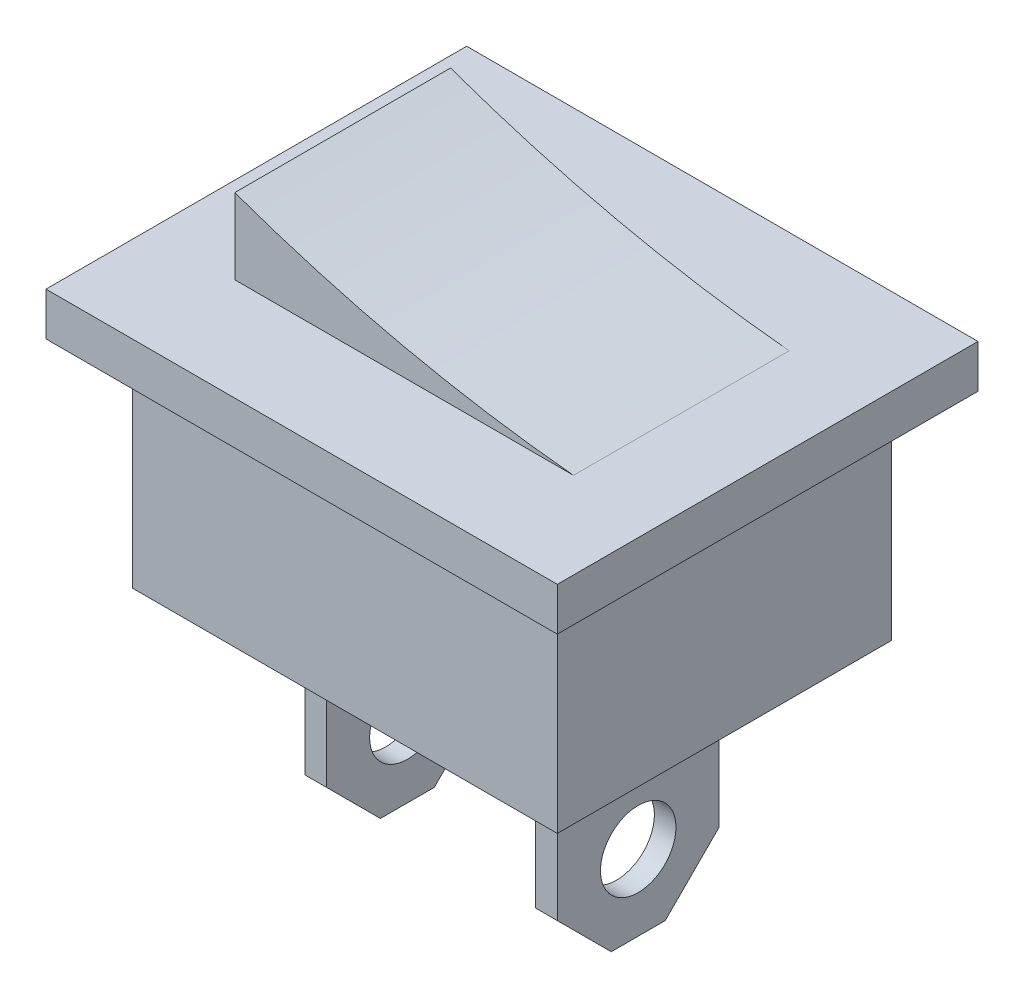
ISO-10303-21;
HEADER;
FILE_DESCRIPTION(('STEP AP214'),'2;1');
FILE_NAME('part.step','',(''),(''),'','','');
FILE_SCHEMA(('AUTOMOTIVE_DESIGN { 1 0 10303 214 1 1 1 1 }'));
ENDSEC;
DATA;
#1=APPLICATION_CONTEXT('core data for automotive mechanical design processes');
#2=APPLICATION_PROTOCOL_DEFINITION('international standard','automotive_design',2000,#1);
#3=PRODUCT_CONTEXT('',#1,'mechanical');
#4=PRODUCT('Part','Part','',(#3));
#5=PRODUCT_RELATED_PRODUCT_CATEGORY('part','',(#4));
#6=PRODUCT_DEFINITION_FORMATION('','',#4);
#7=PRODUCT_DEFINITION_CONTEXT('part definition',#1,'design');
#8=PRODUCT_DEFINITION('design','',#6,#7);
#9=PRODUCT_DEFINITION_SHAPE('','',#8);
#10=(LENGTH_UNIT() NAMED_UNIT(*) SI_UNIT(.MILLI.,.METRE.));
#11=(NAMED_UNIT(*) PLANE_ANGLE_UNIT() SI_UNIT($,.RADIAN.));
#12=(NAMED_UNIT(*) SI_UNIT($,.STERADIAN.) SOLID_ANGLE_UNIT());
#13=UNCERTAINTY_MEASURE_WITH_UNIT(LENGTH_MEASURE(1.E-05),#10,'distance_accuracy_value','');
#14=(GEOMETRIC_REPRESENTATION_CONTEXT(3) GLOBAL_UNCERTAINTY_ASSIGNED_CONTEXT((#13)) GLOBAL_UNIT_ASSIGNED_CONTEXT((#10,
#11,#12)) REPRESENTATION_CONTEXT('',''));
#15=CARTESIAN_POINT('',(0.,0.,0.));
#16=DIRECTION('',(0.,0.,1.));
#17=DIRECTION('',(1.,0.,0.));
#18=AXIS2_PLACEMENT_3D('',#15,#16,#17);
#19=CARTESIAN_POINT('',(2.,12.,-2.75));
#20=DIRECTION('',(0.,1.,0.));
#21=DIRECTION('',(0.,0.,1.));
#22=AXIS2_PLACEMENT_3D('',#19,#20,#21);
#23=PLANE('',#22);
#24=DIRECTION('',(1.,0.,0.));
#25=VECTOR('',#24,1.);
#26=CARTESIAN_POINT('',(2.,12.,-12.75));
#27=LINE('',#26,#25);
#28=CARTESIAN_POINT('',(2.,12.,-12.75));
#29=VERTEX_POINT('',#28);
#30=CARTESIAN_POINT('',(17.7,12.,-12.75));
#31=VERTEX_POINT('',#30);
#32=EDGE_CURVE('E95',#29,#31,#27,.T.);
#33=ORIENTED_EDGE('',*,*,#32,.T.);
#34=DIRECTION('',(0.,0.,-1.));
#35=VECTOR('',#34,1.);
#36=CARTESIAN_POINT('',(17.7,12.,-2.75));
#37=LINE('',#36,#35);
#38=CARTESIAN_POINT('',(17.7,12.,-2.75));
#39=VERTEX_POINT('',#38);
#40=EDGE_CURVE('E12',#39,#31,#37,.T.);
#41=ORIENTED_EDGE('',*,*,#40,.F.);
#42=DIRECTION('',(1.,0.,0.));
#43=VECTOR('',#42,1.);
#44=CARTESIAN_POINT('',(2.,12.,-2.75));
#45=LINE('',#44,#43);
#46=CARTESIAN_POINT('',(2.,12.,-2.75));
#47=VERTEX_POINT('',#46);
#48=EDGE_CURVE('E88',#47,#39,#45,.T.);
#49=ORIENTED_EDGE('',*,*,#48,.F.);
#50=DIRECTION('',(0.,0.,-1.));
#51=VECTOR('',#50,1.);
#52=CARTESIAN_POINT('',(2.,12.,-2.75));
#53=LINE('',#52,#51);
#54=EDGE_CURVE('E96',#47,#29,#53,.T.);
#55=ORIENTED_EDGE('',*,*,#54,.T.);
#56=EDGE_LOOP('',(#33,#41,#49,#55));
#57=FACE_BOUND('',#56,.T.);
#58=ADVANCED_FACE('F48',(#57),#23,.F.);
#59=CARTESIAN_POINT('',(23.8845782013658,76.705107931841,-2.75));
#60=DIRECTION('',(0.,0.,-1.));
#61=DIRECTION('',(-1.,0.,0.));
#62=AXIS2_PLACEMENT_3D('',#59,#60,#61);
#63=CYLINDRICAL_SURFACE('',#62,65.);
#64=CARTESIAN_POINT('',(23.8845782013658,76.705107931841,-12.75));
#65=DIRECTION('',(0.,0.,-1.));
#66=DIRECTION('',(1.,0.,0.));
#67=AXIS2_PLACEMENT_3D('',#64,#65,#66);
#68=CIRCLE('',#67,65.);
#69=CARTESIAN_POINT('',(2.,15.5,-12.75));
#70=VERTEX_POINT('',#69);
#71=EDGE_CURVE('E76',#31,#70,#68,.T.);
#72=ORIENTED_EDGE('',*,*,#71,.T.);
#73=DIRECTION('',(0.,0.,-1.));
#74=VECTOR('',#73,1.);
#75=CARTESIAN_POINT('',(2.,15.5,-2.75));
#76=LINE('',#75,#74);
#77=CARTESIAN_POINT('',(2.,15.5,-2.75));
#78=VERTEX_POINT('',#77);
#79=EDGE_CURVE('E56',#78,#70,#76,.T.);
#80=ORIENTED_EDGE('',*,*,#79,.F.);
#81=CARTESIAN_POINT('',(23.8845782013658,76.705107931841,-2.75));
#82=DIRECTION('',(0.,0.,-1.));
#83=DIRECTION('',(1.,0.,0.));
#84=AXIS2_PLACEMENT_3D('',#81,#82,#83);
#85=CIRCLE('',#84,65.);
#86=EDGE_CURVE('E84',#39,#78,#85,.T.);
#87=ORIENTED_EDGE('',*,*,#86,.F.);
#88=ORIENTED_EDGE('',*,*,#40,.T.);
#89=EDGE_LOOP('',(#72,#80,#87,#88));
#90=FACE_BOUND('',#89,.T.);
#91=ADVANCED_FACE('F85',(#90),#63,.F.);
#92=CARTESIAN_POINT('',(2.,12.,-2.75));
#93=DIRECTION('',(1.,0.,0.));
#94=DIRECTION('',(0.,0.,-1.));
#95=AXIS2_PLACEMENT_3D('',#92,#93,#94);
#96=PLANE('',#95);
#97=DIRECTION('',(0.,-1.,0.));
#98=VECTOR('',#97,1.);
#99=CARTESIAN_POINT('',(2.,12.,-12.75));
#100=LINE('',#99,#98);
#101=EDGE_CURVE('E81',#70,#29,#100,.T.);
#102=ORIENTED_EDGE('',*,*,#101,.T.);
#103=ORIENTED_EDGE('',*,*,#54,.F.);
#104=DIRECTION('',(0.,-1.,0.));
#105=VECTOR('',#104,1.);
#106=CARTESIAN_POINT('',(2.,12.,-2.75));
#107=LINE('',#106,#105);
#108=EDGE_CURVE('E64',#78,#47,#107,.T.);
#109=ORIENTED_EDGE('',*,*,#108,.F.);
#110=ORIENTED_EDGE('',*,*,#79,.T.);
#111=EDGE_LOOP('',(#102,#103,#109,#110));
#112=FACE_BOUND('',#111,.T.);
#113=ADVANCED_FACE('F103',(#112),#96,.F.);
#114=CARTESIAN_POINT('',(23.8845782013658,76.705107931841,-2.75));
#115=DIRECTION('',(0.,0.,1.));
#116=DIRECTION('',(1.,0.,0.));
#117=AXIS2_PLACEMENT_3D('',#114,#115,#116);
#118=PLANE('',#117);
#119=ORIENTED_EDGE('',*,*,#48,.T.);
#120=ORIENTED_EDGE('',*,*,#86,.T.);
#121=ORIENTED_EDGE('',*,*,#108,.T.);
#122=EDGE_LOOP('',(#119,#120,#121));
#123=FACE_BOUND('',#122,.T.);
#124=ADVANCED_FACE('F91',(#123),#118,.T.);
#125=CARTESIAN_POINT('',(23.8845782013658,76.705107931841,-12.75));
#126=DIRECTION('',(0.,0.,1.));
#127=DIRECTION('',(1.,0.,0.));
#128=AXIS2_PLACEMENT_3D('',#125,#126,#127);
#129=PLANE('',#128);
#130=ORIENTED_EDGE('',*,*,#32,.F.);
#131=ORIENTED_EDGE('',*,*,#101,.F.);
#132=ORIENTED_EDGE('',*,*,#71,.F.);
#133=EDGE_LOOP('',(#130,#131,#132));
#134=FACE_BOUND('',#133,.T.);
#135=ADVANCED_FACE('F104',(#134),#129,.F.);
#136=CLOSED_SHELL('',(#58,#91,#113,#124,#135));
#137=MANIFOLD_SOLID_BREP('B2',#136);
#138=CARTESIAN_POINT('',(0.,0.,0.));
#139=DIRECTION('',(0.,-1.,0.));
#140=DIRECTION('',(0.,0.,-1.));
#141=AXIS2_PLACEMENT_3D('',#138,#139,#140);
#142=PLANE('',#141);
#143=DIRECTION('',(0.,0.,1.));
#144=VECTOR('',#143,1.);
#145=CARTESIAN_POINT('',(0.,0.,0.));
#146=LINE('',#145,#144);
#147=CARTESIAN_POINT('',(0.,0.,-15.5));
#148=VERTEX_POINT('',#147);
#149=CARTESIAN_POINT('',(0.,0.,0.));
#150=VERTEX_POINT('',#149);
#151=EDGE_CURVE('E408',#148,#150,#146,.T.);
#152=ORIENTED_EDGE('',*,*,#151,.F.);
#153=DIRECTION('',(-1.,0.,0.));
#154=VECTOR('',#153,1.);
#155=CARTESIAN_POINT('',(0.,0.,-15.5));
#156=LINE('',#155,#154);
#157=CARTESIAN_POINT('',(19.7,0.,-15.5));
#158=VERTEX_POINT('',#157);
#159=EDGE_CURVE('E414',#158,#148,#156,.T.);
#160=ORIENTED_EDGE('',*,*,#159,.F.);
#161=DIRECTION('',(0.,0.,-1.));
#162=VECTOR('',#161,1.);
#163=CARTESIAN_POINT('',(19.7,0.,0.));
#164=LINE('',#163,#162);
#165=CARTESIAN_POINT('',(19.7,0.,0.));
#166=VERTEX_POINT('',#165);
#167=EDGE_CURVE('E433',#166,#158,#164,.T.);
#168=ORIENTED_EDGE('',*,*,#167,.F.);
#169=DIRECTION('',(1.,0.,0.));
#170=VECTOR('',#169,1.);
#171=CARTESIAN_POINT('',(0.,0.,0.));
#172=LINE('',#171,#170);
#173=EDGE_CURVE('E430',#150,#166,#172,.T.);
#174=ORIENTED_EDGE('',*,*,#173,.F.);
#175=EDGE_LOOP('',(#152,#160,#168,#174));
#176=FACE_BOUND('',#175,.T.);
#177=DIRECTION('',(1.,0.,0.));
#178=VECTOR('',#177,1.);
#179=CARTESIAN_POINT('',(15.7,0.,-11.5));
#180=LINE('',#179,#178);
#181=CARTESIAN_POINT('',(14.7,0.,-11.5));
#182=VERTEX_POINT('',#181);
#183=CARTESIAN_POINT('',(15.7,0.,-11.5));
#184=VERTEX_POINT('',#183);
#185=EDGE_CURVE('E344',#182,#184,#180,.T.);
#186=ORIENTED_EDGE('',*,*,#185,.F.);
#187=DIRECTION('',(0.,0.,-1.));
#188=VECTOR('',#187,1.);
#189=CARTESIAN_POINT('',(14.7,0.,-4.));
#190=LINE('',#189,#188);
#191=CARTESIAN_POINT('',(14.7,0.,-4.));
#192=VERTEX_POINT('',#191);
#193=EDGE_CURVE('E297',#192,#182,#190,.T.);
#194=ORIENTED_EDGE('',*,*,#193,.F.);
#195=DIRECTION('',(-1.,0.,0.));
#196=VECTOR('',#195,1.);
#197=CARTESIAN_POINT('',(15.7,0.,-4.));
#198=LINE('',#197,#196);
#199=CARTESIAN_POINT('',(15.7,0.,-4.));
#200=VERTEX_POINT('',#199);
#201=EDGE_CURVE('E336',#200,#192,#198,.T.);
#202=ORIENTED_EDGE('',*,*,#201,.F.);
#203=DIRECTION('',(0.,0.,1.));
#204=VECTOR('',#203,1.);
#205=CARTESIAN_POINT('',(15.7,0.,-4.));
#206=LINE('',#205,#204);
#207=EDGE_CURVE('E348',#184,#200,#206,.T.);
#208=ORIENTED_EDGE('',*,*,#207,.F.);
#209=EDGE_LOOP('',(#186,#194,#202,#208));
#210=FACE_BOUND('',#209,.T.);
#211=DIRECTION('',(1.,0.,0.));
#212=VECTOR('',#211,1.);
#213=CARTESIAN_POINT('',(5.,0.,-11.5));
#214=LINE('',#213,#212);
#215=CARTESIAN_POINT('',(4.,0.,-11.5));
#216=VERTEX_POINT('',#215);
#217=CARTESIAN_POINT('',(5.,0.,-11.5));
#218=VERTEX_POINT('',#217);
#219=EDGE_CURVE('E290',#216,#218,#214,.T.);
#220=ORIENTED_EDGE('',*,*,#219,.F.);
#221=DIRECTION('',(0.,0.,-1.));
#222=VECTOR('',#221,1.);
#223=CARTESIAN_POINT('',(3.99999999999999,0.,-4.));
#224=LINE('',#223,#222);
#225=CARTESIAN_POINT('',(3.99999999999999,0.,-4.));
#226=VERTEX_POINT('',#225);
#227=EDGE_CURVE('E301',#226,#216,#224,.T.);
#228=ORIENTED_EDGE('',*,*,#227,.F.);
#229=DIRECTION('',(-1.,0.,0.));
#230=VECTOR('',#229,1.);
#231=CARTESIAN_POINT('',(5.,0.,-4.));
#232=LINE('',#231,#230);
#233=CARTESIAN_POINT('',(5.,0.,-4.));
#234=VERTEX_POINT('',#233);
#235=EDGE_CURVE('E316',#234,#226,#232,.T.);
#236=ORIENTED_EDGE('',*,*,#235,.F.);
#237=DIRECTION('',(0.,0.,1.));
#238=VECTOR('',#237,1.);
#239=CARTESIAN_POINT('',(5.,0.,-4.));
#240=LINE('',#239,#238);
#241=EDGE_CURVE('E312',#218,#234,#240,.T.);
#242=ORIENTED_EDGE('',*,*,#241,.F.);
#243=EDGE_LOOP('',(#220,#228,#236,#242));
#244=FACE_BOUND('',#243,.T.);
#245=ADVANCED_FACE('F146',(#176,#210,#244),#142,.T.);
#246=CARTESIAN_POINT('',(0.,10.,0.));
#247=DIRECTION('',(1.,0.,0.));
#248=DIRECTION('',(0.,0.,-1.));
#249=AXIS2_PLACEMENT_3D('',#246,#247,#248);
#250=PLANE('',#249);
#251=ORIENTED_EDGE('',*,*,#151,.T.);
#252=DIRECTION('',(0.,-1.,0.));
#253=VECTOR('',#252,1.);
#254=CARTESIAN_POINT('',(0.,10.,0.));
#255=LINE('',#254,#253);
#256=CARTESIAN_POINT('',(0.,10.,0.));
#257=VERTEX_POINT('',#256);
#258=EDGE_CURVE('E449',#257,#150,#255,.T.);
#259=ORIENTED_EDGE('',*,*,#258,.F.);
#260=DIRECTION('',(0.,0.,1.));
#261=VECTOR('',#260,1.);
#262=CARTESIAN_POINT('',(0.,10.,0.));
#263=LINE('',#262,#261);
#264=CARTESIAN_POINT('',(0.,10.,-15.5));
#265=VERTEX_POINT('',#264);
#266=EDGE_CURVE('E409',#265,#257,#263,.T.);
#267=ORIENTED_EDGE('',*,*,#266,.F.);
#268=DIRECTION('',(0.,-1.,0.));
#269=VECTOR('',#268,1.);
#270=CARTESIAN_POINT('',(0.,10.,-15.5));
#271=LINE('',#270,#269);
#272=EDGE_CURVE('E426',#265,#148,#271,.T.);
#273=ORIENTED_EDGE('',*,*,#272,.T.);
#274=EDGE_LOOP('',(#251,#259,#267,#273));
#275=FACE_BOUND('',#274,.T.);
#276=ADVANCED_FACE('F532',(#275),#250,.F.);
#277=CARTESIAN_POINT('',(0.,10.,0.));
#278=DIRECTION('',(0.,0.,-1.));
#279=DIRECTION('',(-1.,0.,0.));
#280=AXIS2_PLACEMENT_3D('',#277,#278,#279);
#281=PLANE('',#280);
#282=ORIENTED_EDGE('',*,*,#173,.T.);
#283=DIRECTION('',(0.,-1.,0.));
#284=VECTOR('',#283,1.);
#285=CARTESIAN_POINT('',(19.7,10.,0.));
#286=LINE('',#285,#284);
#287=CARTESIAN_POINT('',(19.7,10.,0.));
#288=VERTEX_POINT('',#287);
#289=EDGE_CURVE('E445',#288,#166,#286,.T.);
#290=ORIENTED_EDGE('',*,*,#289,.F.);
#291=DIRECTION('',(1.,0.,0.));
#292=VECTOR('',#291,1.);
#293=CARTESIAN_POINT('',(0.,10.,0.));
#294=LINE('',#293,#292);
#295=EDGE_CURVE('E413',#257,#288,#294,.T.);
#296=ORIENTED_EDGE('',*,*,#295,.F.);
#297=ORIENTED_EDGE('',*,*,#258,.T.);
#298=EDGE_LOOP('',(#282,#290,#296,#297));
#299=FACE_BOUND('',#298,.T.);
#300=ADVANCED_FACE('F538',(#299),#281,.F.);
#301=CARTESIAN_POINT('',(19.7,10.,0.));
#302=DIRECTION('',(-1.,0.,0.));
#303=DIRECTION('',(0.,0.,1.));
#304=AXIS2_PLACEMENT_3D('',#301,#302,#303);
#305=PLANE('',#304);
#306=ORIENTED_EDGE('',*,*,#167,.T.);
#307=DIRECTION('',(0.,-1.,0.));
#308=VECTOR('',#307,1.);
#309=CARTESIAN_POINT('',(19.7,10.,-15.5));
#310=LINE('',#309,#308);
#311=CARTESIAN_POINT('',(19.7,10.,-15.5));
#312=VERTEX_POINT('',#311);
#313=EDGE_CURVE('E441',#312,#158,#310,.T.);
#314=ORIENTED_EDGE('',*,*,#313,.F.);
#315=DIRECTION('',(0.,0.,-1.));
#316=VECTOR('',#315,1.);
#317=CARTESIAN_POINT('',(19.7,10.,0.));
#318=LINE('',#317,#316);
#319=EDGE_CURVE('E418',#288,#312,#318,.T.);
#320=ORIENTED_EDGE('',*,*,#319,.F.);
#321=ORIENTED_EDGE('',*,*,#289,.T.);
#322=EDGE_LOOP('',(#306,#314,#320,#321));
#323=FACE_BOUND('',#322,.T.);
#324=ADVANCED_FACE('F550',(#323),#305,.F.);
#325=CARTESIAN_POINT('',(0.,10.,-15.5));
#326=DIRECTION('',(0.,0.,1.));
#327=DIRECTION('',(1.,0.,0.));
#328=AXIS2_PLACEMENT_3D('',#325,#326,#327);
#329=PLANE('',#328);
#330=ORIENTED_EDGE('',*,*,#159,.T.);
#331=ORIENTED_EDGE('',*,*,#272,.F.);
#332=DIRECTION('',(-1.,0.,0.));
#333=VECTOR('',#332,1.);
#334=CARTESIAN_POINT('',(0.,10.,-15.5));
#335=LINE('',#334,#333);
#336=EDGE_CURVE('E422',#312,#265,#335,.T.);
#337=ORIENTED_EDGE('',*,*,#336,.F.);
#338=ORIENTED_EDGE('',*,*,#313,.T.);
#339=EDGE_LOOP('',(#330,#331,#337,#338));
#340=FACE_BOUND('',#339,.T.);
#341=ADVANCED_FACE('F546',(#340),#329,.F.);
#342=CARTESIAN_POINT('',(0.,10.,0.));
#343=DIRECTION('',(0.,1.,0.));
#344=DIRECTION('',(0.,0.,1.));
#345=AXIS2_PLACEMENT_3D('',#342,#343,#344);
#346=PLANE('',#345);
#347=DIRECTION('',(-1.,0.,0.));
#348=VECTOR('',#347,1.);
#349=CARTESIAN_POINT('',(21.7,10.,-17.5));
#350=LINE('',#349,#348);
#351=CARTESIAN_POINT('',(21.7,10.,-17.5));
#352=VERTEX_POINT('',#351);
#353=CARTESIAN_POINT('',(-2.,10.,-17.5));
#354=VERTEX_POINT('',#353);
#355=EDGE_CURVE('E366',#352,#354,#350,.T.);
#356=ORIENTED_EDGE('',*,*,#355,.F.);
#357=DIRECTION('',(0.,0.,-1.));
#358=VECTOR('',#357,1.);
#359=CARTESIAN_POINT('',(21.7,10.,2.));
#360=LINE('',#359,#358);
#361=CARTESIAN_POINT('',(21.7,10.,2.));
#362=VERTEX_POINT('',#361);
#363=EDGE_CURVE('E372',#362,#352,#360,.T.);
#364=ORIENTED_EDGE('',*,*,#363,.F.);
#365=DIRECTION('',(1.,0.,0.));
#366=VECTOR('',#365,1.);
#367=CARTESIAN_POINT('',(-2.,10.,2.));
#368=LINE('',#367,#366);
#369=CARTESIAN_POINT('',(-2.,10.,2.));
#370=VERTEX_POINT('',#369);
#371=EDGE_CURVE('E388',#370,#362,#368,.T.);
#372=ORIENTED_EDGE('',*,*,#371,.F.);
#373=DIRECTION('',(0.,0.,1.));
#374=VECTOR('',#373,1.);
#375=CARTESIAN_POINT('',(-2.,10.,-17.5));
#376=LINE('',#375,#374);
#377=EDGE_CURVE('E385',#354,#370,#376,.T.);
#378=ORIENTED_EDGE('',*,*,#377,.F.);
#379=EDGE_LOOP('',(#356,#364,#372,#378));
#380=FACE_BOUND('',#379,.T.);
#381=ORIENTED_EDGE('',*,*,#336,.T.);
#382=ORIENTED_EDGE('',*,*,#266,.T.);
#383=ORIENTED_EDGE('',*,*,#295,.T.);
#384=ORIENTED_EDGE('',*,*,#319,.T.);
#385=EDGE_LOOP('',(#381,#382,#383,#384));
#386=FACE_BOUND('',#385,.T.);
#387=ADVANCED_FACE('F549',(#380,#386),#346,.F.);
#388=CARTESIAN_POINT('',(21.7,12.,-17.5));
#389=DIRECTION('',(0.,0.,1.));
#390=DIRECTION('',(1.,0.,0.));
#391=AXIS2_PLACEMENT_3D('',#388,#389,#390);
#392=PLANE('',#391);
#393=ORIENTED_EDGE('',*,*,#355,.T.);
#394=DIRECTION('',(0.,-1.,0.));
#395=VECTOR('',#394,1.);
#396=CARTESIAN_POINT('',(-2.,12.,-17.5));
#397=LINE('',#396,#395);
#398=CARTESIAN_POINT('',(-2.,12.,-17.5));
#399=VERTEX_POINT('',#398);
#400=EDGE_CURVE('E404',#399,#354,#397,.T.);
#401=ORIENTED_EDGE('',*,*,#400,.F.);
#402=DIRECTION('',(-1.,0.,0.));
#403=VECTOR('',#402,1.);
#404=CARTESIAN_POINT('',(21.7,12.,-17.5));
#405=LINE('',#404,#403);
#406=CARTESIAN_POINT('',(21.7,12.,-17.5));
#407=VERTEX_POINT('',#406);
#408=EDGE_CURVE('E367',#407,#399,#405,.T.);
#409=ORIENTED_EDGE('',*,*,#408,.F.);
#410=DIRECTION('',(0.,-1.,0.));
#411=VECTOR('',#410,1.);
#412=CARTESIAN_POINT('',(21.7,12.,-17.5));
#413=LINE('',#412,#411);
#414=EDGE_CURVE('E381',#407,#352,#413,.T.);
#415=ORIENTED_EDGE('',*,*,#414,.T.);
#416=EDGE_LOOP('',(#393,#401,#409,#415));
#417=FACE_BOUND('',#416,.T.);
#418=ADVANCED_FACE('F544',(#417),#392,.F.);
#419=CARTESIAN_POINT('',(-2.,12.,-17.5));
#420=DIRECTION('',(1.,0.,0.));
#421=DIRECTION('',(0.,0.,-1.));
#422=AXIS2_PLACEMENT_3D('',#419,#420,#421);
#423=PLANE('',#422);
#424=ORIENTED_EDGE('',*,*,#377,.T.);
#425=DIRECTION('',(0.,-1.,0.));
#426=VECTOR('',#425,1.);
#427=CARTESIAN_POINT('',(-2.,12.,2.));
#428=LINE('',#427,#426);
#429=CARTESIAN_POINT('',(-2.,12.,2.));
#430=VERTEX_POINT('',#429);
#431=EDGE_CURVE('E400',#430,#370,#428,.T.);
#432=ORIENTED_EDGE('',*,*,#431,.F.);
#433=DIRECTION('',(0.,0.,1.));
#434=VECTOR('',#433,1.);
#435=CARTESIAN_POINT('',(-2.,12.,-17.5));
#436=LINE('',#435,#434);
#437=EDGE_CURVE('E371',#399,#430,#436,.T.);
#438=ORIENTED_EDGE('',*,*,#437,.F.);
#439=ORIENTED_EDGE('',*,*,#400,.T.);
#440=EDGE_LOOP('',(#424,#432,#438,#439));
#441=FACE_BOUND('',#440,.T.);
#442=ADVANCED_FACE('F711',(#441),#423,.F.);
#443=CARTESIAN_POINT('',(-2.,12.,2.));
#444=DIRECTION('',(0.,0.,-1.));
#445=DIRECTION('',(-1.,0.,0.));
#446=AXIS2_PLACEMENT_3D('',#443,#444,#445);
#447=PLANE('',#446);
#448=ORIENTED_EDGE('',*,*,#371,.T.);
#449=DIRECTION('',(0.,-1.,0.));
#450=VECTOR('',#449,1.);
#451=CARTESIAN_POINT('',(21.7,12.,2.));
#452=LINE('',#451,#450);
#453=CARTESIAN_POINT('',(21.7,12.,2.));
#454=VERTEX_POINT('',#453);
#455=EDGE_CURVE('E396',#454,#362,#452,.T.);
#456=ORIENTED_EDGE('',*,*,#455,.F.);
#457=DIRECTION('',(1.,0.,0.));
#458=VECTOR('',#457,1.);
#459=CARTESIAN_POINT('',(-2.,12.,2.));
#460=LINE('',#459,#458);
#461=EDGE_CURVE('E375',#430,#454,#460,.T.);
#462=ORIENTED_EDGE('',*,*,#461,.F.);
#463=ORIENTED_EDGE('',*,*,#431,.T.);
#464=EDGE_LOOP('',(#448,#456,#462,#463));
#465=FACE_BOUND('',#464,.T.);
#466=ADVANCED_FACE('F701',(#465),#447,.F.);
#467=CARTESIAN_POINT('',(21.7,12.,2.));
#468=DIRECTION('',(-1.,0.,0.));
#469=DIRECTION('',(0.,0.,1.));
#470=AXIS2_PLACEMENT_3D('',#467,#468,#469);
#471=PLANE('',#470);
#472=ORIENTED_EDGE('',*,*,#363,.T.);
#473=ORIENTED_EDGE('',*,*,#414,.F.);
#474=DIRECTION('',(0.,0.,-1.));
#475=VECTOR('',#474,1.);
#476=CARTESIAN_POINT('',(21.7,12.,2.));
#477=LINE('',#476,#475);
#478=EDGE_CURVE('E378',#454,#407,#477,.T.);
#479=ORIENTED_EDGE('',*,*,#478,.F.);
#480=ORIENTED_EDGE('',*,*,#455,.T.);
#481=EDGE_LOOP('',(#472,#473,#479,#480));
#482=FACE_BOUND('',#481,.T.);
#483=ADVANCED_FACE('F691',(#482),#471,.F.);
#484=CARTESIAN_POINT('',(0.,12.,0.));
#485=DIRECTION('',(0.,1.,0.));
#486=DIRECTION('',(0.,0.,1.));
#487=AXIS2_PLACEMENT_3D('',#484,#485,#486);
#488=PLANE('',#487);
#489=ORIENTED_EDGE('',*,*,#408,.T.);
#490=ORIENTED_EDGE('',*,*,#437,.T.);
#491=ORIENTED_EDGE('',*,*,#461,.T.);
#492=ORIENTED_EDGE('',*,*,#478,.T.);
#493=EDGE_LOOP('',(#489,#490,#491,#492));
#494=FACE_BOUND('',#493,.T.);
#495=ADVANCED_FACE('F528',(#494),#488,.T.);
#496=CARTESIAN_POINT('',(14.7,-10.,-4.));
#497=DIRECTION('',(1.,0.,0.));
#498=DIRECTION('',(0.,0.,-1.));
#499=AXIS2_PLACEMENT_3D('',#496,#497,#498);
#500=PLANE('',#499);
#501=CARTESIAN_POINT('',(14.7,-6.5,-7.75));
#502=DIRECTION('',(1.,0.,0.));
#503=DIRECTION('',(0.,0.,-1.));
#504=AXIS2_PLACEMENT_3D('',#501,#502,#503);
#505=CIRCLE('',#504,1.75);
#506=CARTESIAN_POINT('',(14.7,-6.5,-9.5));
#507=VERTEX_POINT('',#506);
#508=EDGE_CURVE('E309',#507,#507,#505,.T.);
#509=ORIENTED_EDGE('',*,*,#508,.T.);
#510=EDGE_LOOP('',(#509));
#511=FACE_BOUND('',#510,.T.);
#512=DIRECTION('',(0.,0.,-1.));
#513=VECTOR('',#512,1.);
#514=CARTESIAN_POINT('',(14.7,-10.,-4.));
#515=LINE('',#514,#513);
#516=CARTESIAN_POINT('',(14.7,-10.,-6.49999999999999));
#517=VERTEX_POINT('',#516);
#518=CARTESIAN_POINT('',(14.7,-10.,-9.00000000000001));
#519=VERTEX_POINT('',#518);
#520=EDGE_CURVE('E331',#517,#519,#515,.T.);
#521=ORIENTED_EDGE('',*,*,#520,.F.);
#522=DIRECTION('',(0.,-0.707106781186549,-0.707106781186547));
#523=VECTOR('',#522,1.);
#524=CARTESIAN_POINT('',(14.7,-10.,-6.49999999999999));
#525=LINE('',#524,#523);
#526=CARTESIAN_POINT('',(14.7,-7.5,-4.));
#527=VERTEX_POINT('',#526);
#528=EDGE_CURVE('E489',#517,#527,#525,.F.);
#529=ORIENTED_EDGE('',*,*,#528,.T.);
#530=DIRECTION('',(0.,1.,0.));
#531=VECTOR('',#530,1.);
#532=CARTESIAN_POINT('',(14.7,-10.,-4.));
#533=LINE('',#532,#531);
#534=EDGE_CURVE('E340',#527,#192,#533,.T.);
#535=ORIENTED_EDGE('',*,*,#534,.T.);
#536=ORIENTED_EDGE('',*,*,#193,.T.);
#537=DIRECTION('',(0.,1.,0.));
#538=VECTOR('',#537,1.);
#539=CARTESIAN_POINT('',(14.7,-10.,-11.5));
#540=LINE('',#539,#538);
#541=CARTESIAN_POINT('',(14.7,-7.5,-11.5));
#542=VERTEX_POINT('',#541);
#543=EDGE_CURVE('E363',#542,#182,#540,.T.);
#544=ORIENTED_EDGE('',*,*,#543,.F.);
#545=DIRECTION('',(0.,0.707106781186549,-0.707106781186547));
#546=VECTOR('',#545,1.);
#547=CARTESIAN_POINT('',(14.7,-10.,-9.00000000000001));
#548=LINE('',#547,#546);
#549=EDGE_CURVE('E486',#542,#519,#548,.F.);
#550=ORIENTED_EDGE('',*,*,#549,.T.);
#551=EDGE_LOOP('',(#521,#529,#535,#536,#544,#550));
#552=FACE_BOUND('',#551,.T.);
#553=ADVANCED_FACE('F507',(#511,#552),#500,.F.);
#554=CARTESIAN_POINT('',(15.7,-10.,-11.5));
#555=DIRECTION('',(0.,0.,1.));
#556=DIRECTION('',(1.,0.,0.));
#557=AXIS2_PLACEMENT_3D('',#554,#555,#556);
#558=PLANE('',#557);
#559=DIRECTION('',(0.,1.,0.));
#560=VECTOR('',#559,1.);
#561=CARTESIAN_POINT('',(15.7,-10.,-11.5));
#562=LINE('',#561,#560);
#563=CARTESIAN_POINT('',(15.7,-7.5,-11.5));
#564=VERTEX_POINT('',#563);
#565=EDGE_CURVE('E360',#564,#184,#562,.T.);
#566=ORIENTED_EDGE('',*,*,#565,.F.);
#567=DIRECTION('',(-1.,0.,0.));
#568=VECTOR('',#567,1.);
#569=CARTESIAN_POINT('',(15.7,-7.5,-11.5));
#570=LINE('',#569,#568);
#571=EDGE_CURVE('E46',#564,#542,#570,.T.);
#572=ORIENTED_EDGE('',*,*,#571,.T.);
#573=ORIENTED_EDGE('',*,*,#543,.T.);
#574=ORIENTED_EDGE('',*,*,#185,.T.);
#575=EDGE_LOOP('',(#566,#572,#573,#574));
#576=FACE_BOUND('',#575,.T.);
#577=ADVANCED_FACE('F519',(#576),#558,.F.);
#578=CARTESIAN_POINT('',(15.7,-10.,-4.));
#579=DIRECTION('',(-1.,0.,0.));
#580=DIRECTION('',(0.,0.,1.));
#581=AXIS2_PLACEMENT_3D('',#578,#579,#580);
#582=PLANE('',#581);
#583=CARTESIAN_POINT('',(15.7,-6.5,-7.75));
#584=DIRECTION('',(1.,0.,0.));
#585=DIRECTION('',(0.,0.,-1.));
#586=AXIS2_PLACEMENT_3D('',#583,#584,#585);
#587=CIRCLE('',#586,1.75);
#588=CARTESIAN_POINT('',(15.7,-6.5,-9.5));
#589=VERTEX_POINT('',#588);
#590=EDGE_CURVE('E794',#589,#589,#587,.T.);
#591=ORIENTED_EDGE('',*,*,#590,.F.);
#592=EDGE_LOOP('',(#591));
#593=FACE_BOUND('',#592,.T.);
#594=DIRECTION('',(0.,1.,0.));
#595=VECTOR('',#594,1.);
#596=CARTESIAN_POINT('',(15.7,-10.,-4.));
#597=LINE('',#596,#595);
#598=CARTESIAN_POINT('',(15.7,-7.5,-4.));
#599=VERTEX_POINT('',#598);
#600=EDGE_CURVE('E357',#599,#200,#597,.T.);
#601=ORIENTED_EDGE('',*,*,#600,.F.);
#602=DIRECTION('',(0.,0.707106781186549,0.707106781186547));
#603=VECTOR('',#602,1.);
#604=CARTESIAN_POINT('',(15.7,-10.,-6.49999999999999));
#605=LINE('',#604,#603);
#606=CARTESIAN_POINT('',(15.7,-10.,-6.49999999999999));
#607=VERTEX_POINT('',#606);
#608=EDGE_CURVE('E156',#599,#607,#605,.F.);
#609=ORIENTED_EDGE('',*,*,#608,.T.);
#610=DIRECTION('',(0.,0.,1.));
#611=VECTOR('',#610,1.);
#612=CARTESIAN_POINT('',(15.7,-10.,-4.));
#613=LINE('',#612,#611);
#614=CARTESIAN_POINT('',(15.7,-10.,-9.00000000000001));
#615=VERTEX_POINT('',#614);
#616=EDGE_CURVE('E335',#615,#607,#613,.T.);
#617=ORIENTED_EDGE('',*,*,#616,.F.);
#618=DIRECTION('',(0.,-0.707106781186549,0.707106781186547));
#619=VECTOR('',#618,1.);
#620=CARTESIAN_POINT('',(15.7,-10.,-9.00000000000001));
#621=LINE('',#620,#619);
#622=EDGE_CURVE('E163',#615,#564,#621,.F.);
#623=ORIENTED_EDGE('',*,*,#622,.T.);
#624=ORIENTED_EDGE('',*,*,#565,.T.);
#625=ORIENTED_EDGE('',*,*,#207,.T.);
#626=EDGE_LOOP('',(#601,#609,#617,#623,#624,#625));
#627=FACE_BOUND('',#626,.T.);
#628=ADVANCED_FACE('F498',(#593,#627),#582,.F.);
#629=CARTESIAN_POINT('',(15.7,-10.,-4.));
#630=DIRECTION('',(0.,0.,-1.));
#631=DIRECTION('',(-1.,0.,0.));
#632=AXIS2_PLACEMENT_3D('',#629,#630,#631);
#633=PLANE('',#632);
#634=ORIENTED_EDGE('',*,*,#534,.F.);
#635=DIRECTION('',(1.,0.,0.));
#636=VECTOR('',#635,1.);
#637=CARTESIAN_POINT('',(15.7,-7.5,-4.));
#638=LINE('',#637,#636);
#639=EDGE_CURVE('E171',#527,#599,#638,.T.);
#640=ORIENTED_EDGE('',*,*,#639,.T.);
#641=ORIENTED_EDGE('',*,*,#600,.T.);
#642=ORIENTED_EDGE('',*,*,#201,.T.);
#643=EDGE_LOOP('',(#634,#640,#641,#642));
#644=FACE_BOUND('',#643,.T.);
#645=ADVANCED_FACE('F508',(#644),#633,.F.);
#646=CARTESIAN_POINT('',(0.,-10.,0.));
#647=DIRECTION('',(0.,1.,0.));
#648=DIRECTION('',(0.,0.,1.));
#649=AXIS2_PLACEMENT_3D('',#646,#647,#648);
#650=PLANE('',#649);
#651=ORIENTED_EDGE('',*,*,#616,.T.);
#652=DIRECTION('',(-1.,0.,0.));
#653=VECTOR('',#652,1.);
#654=CARTESIAN_POINT('',(0.,-10.,-6.49999999999999));
#655=LINE('',#654,#653);
#656=EDGE_CURVE('E482',#607,#517,#655,.T.);
#657=ORIENTED_EDGE('',*,*,#656,.T.);
#658=ORIENTED_EDGE('',*,*,#520,.T.);
#659=DIRECTION('',(1.,0.,0.));
#660=VECTOR('',#659,1.);
#661=CARTESIAN_POINT('',(0.,-10.,-9.00000000000001));
#662=LINE('',#661,#660);
#663=EDGE_CURVE('E478',#519,#615,#662,.T.);
#664=ORIENTED_EDGE('',*,*,#663,.T.);
#665=EDGE_LOOP('',(#651,#657,#658,#664));
#666=FACE_BOUND('',#665,.T.);
#667=ADVANCED_FACE('F502',(#666),#650,.F.);
#668=CARTESIAN_POINT('',(3.99999999999999,-10.,-4.));
#669=DIRECTION('',(1.,0.,0.));
#670=DIRECTION('',(0.,0.,-1.));
#671=AXIS2_PLACEMENT_3D('',#668,#669,#670);
#672=PLANE('',#671);
#673=CARTESIAN_POINT('',(3.99999999999999,-6.5,-7.75));
#674=DIRECTION('',(1.,0.,0.));
#675=DIRECTION('',(0.,0.,-1.));
#676=AXIS2_PLACEMENT_3D('',#673,#674,#675);
#677=CIRCLE('',#676,1.75);
#678=CARTESIAN_POINT('',(3.99999999999999,-6.5,-9.5));
#679=VERTEX_POINT('',#678);
#680=EDGE_CURVE('E792',#679,#679,#677,.F.);
#681=ORIENTED_EDGE('',*,*,#680,.F.);
#682=EDGE_LOOP('',(#681));
#683=FACE_BOUND('',#682,.T.);
#684=DIRECTION('',(0.,1.,0.));
#685=VECTOR('',#684,1.);
#686=CARTESIAN_POINT('',(4.,-10.,-11.5));
#687=LINE('',#686,#685);
#688=CARTESIAN_POINT('',(4.,-7.5,-11.5));
#689=VERTEX_POINT('',#688);
#690=EDGE_CURVE('E285',#689,#216,#687,.T.);
#691=ORIENTED_EDGE('',*,*,#690,.F.);
#692=DIRECTION('',(0.,0.707106781186549,-0.707106781186547));
#693=VECTOR('',#692,1.);
#694=CARTESIAN_POINT('',(4.,-10.,-9.00000000000001));
#695=LINE('',#694,#693);
#696=CARTESIAN_POINT('',(4.,-10.,-9.00000000000001));
#697=VERTEX_POINT('',#696);
#698=EDGE_CURVE('E472',#689,#697,#695,.F.);
#699=ORIENTED_EDGE('',*,*,#698,.T.);
#700=DIRECTION('',(0.,0.,-1.));
#701=VECTOR('',#700,1.);
#702=CARTESIAN_POINT('',(3.99999999999999,-10.,-4.));
#703=LINE('',#702,#701);
#704=CARTESIAN_POINT('',(3.99999999999999,-10.,-6.5));
#705=VERTEX_POINT('',#704);
#706=EDGE_CURVE('E322',#705,#697,#703,.T.);
#707=ORIENTED_EDGE('',*,*,#706,.F.);
#708=DIRECTION('',(0.,-0.707106781186549,-0.707106781186546));
#709=VECTOR('',#708,1.);
#710=CARTESIAN_POINT('',(3.99999999999999,-10.,-6.5));
#711=LINE('',#710,#709);
#712=CARTESIAN_POINT('',(3.99999999999999,-7.49999999999999,-4.));
#713=VERTEX_POINT('',#712);
#714=EDGE_CURVE('E469',#705,#713,#711,.F.);
#715=ORIENTED_EDGE('',*,*,#714,.T.);
#716=DIRECTION('',(0.,1.,0.));
#717=VECTOR('',#716,1.);
#718=CARTESIAN_POINT('',(3.99999999999999,-10.,-4.));
#719=LINE('',#718,#717);
#720=EDGE_CURVE('E304',#713,#226,#719,.T.);
#721=ORIENTED_EDGE('',*,*,#720,.T.);
#722=ORIENTED_EDGE('',*,*,#227,.T.);
#723=EDGE_LOOP('',(#691,#699,#707,#715,#721,#722));
#724=FACE_BOUND('',#723,.T.);
#725=ADVANCED_FACE('F302',(#683,#724),#672,.F.);
#726=CARTESIAN_POINT('',(5.,-10.,-11.5));
#727=DIRECTION('',(0.,0.,1.));
#728=DIRECTION('',(1.,0.,0.));
#729=AXIS2_PLACEMENT_3D('',#726,#727,#728);
#730=PLANE('',#729);
#731=DIRECTION('',(0.,1.,0.));
#732=VECTOR('',#731,1.);
#733=CARTESIAN_POINT('',(5.,-10.,-11.5));
#734=LINE('',#733,#732);
#735=CARTESIAN_POINT('',(5.,-7.5,-11.5));
#736=VERTEX_POINT('',#735);
#737=EDGE_CURVE('E298',#736,#218,#734,.T.);
#738=ORIENTED_EDGE('',*,*,#737,.F.);
#739=DIRECTION('',(-1.,0.,0.));
#740=VECTOR('',#739,1.);
#741=CARTESIAN_POINT('',(5.,-7.5,-11.5));
#742=LINE('',#741,#740);
#743=EDGE_CURVE('E293',#736,#689,#742,.T.);
#744=ORIENTED_EDGE('',*,*,#743,.T.);
#745=ORIENTED_EDGE('',*,*,#690,.T.);
#746=ORIENTED_EDGE('',*,*,#219,.T.);
#747=EDGE_LOOP('',(#738,#744,#745,#746));
#748=FACE_BOUND('',#747,.T.);
#749=ADVANCED_FACE('F288',(#748),#730,.F.);
#750=CARTESIAN_POINT('',(5.,-10.,-4.));
#751=DIRECTION('',(-1.,0.,0.));
#752=DIRECTION('',(0.,0.,1.));
#753=AXIS2_PLACEMENT_3D('',#750,#751,#752);
#754=PLANE('',#753);
#755=CARTESIAN_POINT('',(5.,-6.5,-7.75));
#756=DIRECTION('',(-1.,0.,0.));
#757=DIRECTION('',(0.,0.,1.));
#758=AXIS2_PLACEMENT_3D('',#755,#756,#757);
#759=CIRCLE('',#758,1.75);
#760=CARTESIAN_POINT('',(5.,-6.5,-6.));
#761=VERTEX_POINT('',#760);
#762=EDGE_CURVE('E150',#761,#761,#759,.T.);
#763=ORIENTED_EDGE('',*,*,#762,.T.);
#764=EDGE_LOOP('',(#763));
#765=FACE_BOUND('',#764,.T.);
#766=DIRECTION('',(0.,0.,1.));
#767=VECTOR('',#766,1.);
#768=CARTESIAN_POINT('',(5.,-10.,-4.));
#769=LINE('',#768,#767);
#770=CARTESIAN_POINT('',(5.,-10.,-9.00000000000001));
#771=VERTEX_POINT('',#770);
#772=CARTESIAN_POINT('',(5.,-10.,-6.5));
#773=VERTEX_POINT('',#772);
#774=EDGE_CURVE('E326',#771,#773,#769,.T.);
#775=ORIENTED_EDGE('',*,*,#774,.F.);
#776=DIRECTION('',(0.,-0.707106781186549,0.707106781186547));
#777=VECTOR('',#776,1.);
#778=CARTESIAN_POINT('',(5.,-10.,-9.00000000000001));
#779=LINE('',#778,#777);
#780=EDGE_CURVE('E464',#771,#736,#779,.F.);
#781=ORIENTED_EDGE('',*,*,#780,.T.);
#782=ORIENTED_EDGE('',*,*,#737,.T.);
#783=ORIENTED_EDGE('',*,*,#241,.T.);
#784=DIRECTION('',(0.,1.,0.));
#785=VECTOR('',#784,1.);
#786=CARTESIAN_POINT('',(5.,-10.,-4.));
#787=LINE('',#786,#785);
#788=CARTESIAN_POINT('',(5.,-7.49999999999999,-4.));
#789=VERTEX_POINT('',#788);
#790=EDGE_CURVE('E325',#789,#234,#787,.T.);
#791=ORIENTED_EDGE('',*,*,#790,.F.);
#792=DIRECTION('',(0.,0.707106781186549,0.707106781186546));
#793=VECTOR('',#792,1.);
#794=CARTESIAN_POINT('',(5.,-10.,-6.5));
#795=LINE('',#794,#793);
#796=EDGE_CURVE('E461',#789,#773,#795,.F.);
#797=ORIENTED_EDGE('',*,*,#796,.T.);
#798=EDGE_LOOP('',(#775,#781,#782,#783,#791,#797));
#799=FACE_BOUND('',#798,.T.);
#800=ADVANCED_FACE('F590',(#765,#799),#754,.F.);
#801=CARTESIAN_POINT('',(5.,-10.,-4.));
#802=DIRECTION('',(0.,0.,-1.));
#803=DIRECTION('',(-1.,0.,0.));
#804=AXIS2_PLACEMENT_3D('',#801,#802,#803);
#805=PLANE('',#804);
#806=ORIENTED_EDGE('',*,*,#720,.F.);
#807=DIRECTION('',(1.,0.,0.));
#808=VECTOR('',#807,1.);
#809=CARTESIAN_POINT('',(5.,-7.49999999999999,-4.));
#810=LINE('',#809,#808);
#811=EDGE_CURVE('E475',#713,#789,#810,.T.);
#812=ORIENTED_EDGE('',*,*,#811,.T.);
#813=ORIENTED_EDGE('',*,*,#790,.T.);
#814=ORIENTED_EDGE('',*,*,#235,.T.);
#815=EDGE_LOOP('',(#806,#812,#813,#814));
#816=FACE_BOUND('',#815,.T.);
#817=ADVANCED_FACE('F586',(#816),#805,.F.);
#818=CARTESIAN_POINT('',(0.,-10.,0.));
#819=DIRECTION('',(0.,1.,0.));
#820=DIRECTION('',(0.,0.,1.));
#821=AXIS2_PLACEMENT_3D('',#818,#819,#820);
#822=PLANE('',#821);
#823=ORIENTED_EDGE('',*,*,#706,.T.);
#824=DIRECTION('',(1.,0.,0.));
#825=VECTOR('',#824,1.);
#826=CARTESIAN_POINT('',(0.,-10.,-9.00000000000001));
#827=LINE('',#826,#825);
#828=EDGE_CURVE('E457',#697,#771,#827,.T.);
#829=ORIENTED_EDGE('',*,*,#828,.T.);
#830=ORIENTED_EDGE('',*,*,#774,.T.);
#831=DIRECTION('',(-1.,0.,0.));
#832=VECTOR('',#831,1.);
#833=CARTESIAN_POINT('',(0.,-10.,-6.5));
#834=LINE('',#833,#832);
#835=EDGE_CURVE('E453',#773,#705,#834,.T.);
#836=ORIENTED_EDGE('',*,*,#835,.T.);
#837=EDGE_LOOP('',(#823,#829,#830,#836));
#838=FACE_BOUND('',#837,.T.);
#839=ADVANCED_FACE('F562',(#838),#822,.F.);
#840=CARTESIAN_POINT('',(0.,-10.,-9.00000000000001));
#841=DIRECTION('',(0.,0.707106781186547,0.707106781186549));
#842=DIRECTION('',(1.,0.,0.));
#843=AXIS2_PLACEMENT_3D('',#840,#841,#842);
#844=PLANE('',#843);
#845=ORIENTED_EDGE('',*,*,#698,.F.);
#846=ORIENTED_EDGE('',*,*,#743,.F.);
#847=ORIENTED_EDGE('',*,*,#780,.F.);
#848=ORIENTED_EDGE('',*,*,#828,.F.);
#849=EDGE_LOOP('',(#845,#846,#847,#848));
#850=FACE_BOUND('',#849,.T.);
#851=ADVANCED_FACE('F558',(#850),#844,.F.);
#852=CARTESIAN_POINT('',(0.,-10.,-6.5));
#853=DIRECTION('',(0.,0.707106781186546,-0.707106781186549));
#854=DIRECTION('',(-1.,0.,0.));
#855=AXIS2_PLACEMENT_3D('',#852,#853,#854);
#856=PLANE('',#855);
#857=ORIENTED_EDGE('',*,*,#796,.F.);
#858=ORIENTED_EDGE('',*,*,#811,.F.);
#859=ORIENTED_EDGE('',*,*,#714,.F.);
#860=ORIENTED_EDGE('',*,*,#835,.F.);
#861=EDGE_LOOP('',(#857,#858,#859,#860));
#862=FACE_BOUND('',#861,.T.);
#863=ADVANCED_FACE('F561',(#862),#856,.F.);
#864=CARTESIAN_POINT('',(0.,-10.,-6.49999999999999));
#865=DIRECTION('',(0.,0.707106781186547,-0.707106781186549));
#866=DIRECTION('',(-1.,0.,0.));
#867=AXIS2_PLACEMENT_3D('',#864,#865,#866);
#868=PLANE('',#867);
#869=ORIENTED_EDGE('',*,*,#608,.F.);
#870=ORIENTED_EDGE('',*,*,#639,.F.);
#871=ORIENTED_EDGE('',*,*,#528,.F.);
#872=ORIENTED_EDGE('',*,*,#656,.F.);
#873=EDGE_LOOP('',(#869,#870,#871,#872));
#874=FACE_BOUND('',#873,.T.);
#875=ADVANCED_FACE('F505',(#874),#868,.F.);
#876=CARTESIAN_POINT('',(0.,-10.,-9.00000000000001));
#877=DIRECTION('',(0.,0.707106781186547,0.707106781186549));
#878=DIRECTION('',(1.,0.,0.));
#879=AXIS2_PLACEMENT_3D('',#876,#877,#878);
#880=PLANE('',#879);
#881=ORIENTED_EDGE('',*,*,#549,.F.);
#882=ORIENTED_EDGE('',*,*,#571,.F.);
#883=ORIENTED_EDGE('',*,*,#622,.F.);
#884=ORIENTED_EDGE('',*,*,#663,.F.);
#885=EDGE_LOOP('',(#881,#882,#883,#884));
#886=FACE_BOUND('',#885,.T.);
#887=ADVANCED_FACE('F148',(#886),#880,.F.);
#888=CARTESIAN_POINT('',(-0.949747468305839,-6.5,-7.75));
#889=DIRECTION('',(1.,0.,0.));
#890=DIRECTION('',(0.,0.,-1.));
#891=AXIS2_PLACEMENT_3D('',#888,#889,#890);
#892=CYLINDRICAL_SURFACE('',#891,1.75);
#893=ORIENTED_EDGE('',*,*,#680,.T.);
#894=EDGE_LOOP('',(#893));
#895=FACE_BOUND('',#894,.T.);
#896=ORIENTED_EDGE('',*,*,#762,.F.);
#897=EDGE_LOOP('',(#896));
#898=FACE_BOUND('',#897,.T.);
#899=ADVANCED_FACE('F570',(#895,#898),#892,.F.);
#900=ORIENTED_EDGE('',*,*,#590,.T.);
#901=EDGE_LOOP('',(#900));
#902=FACE_BOUND('',#901,.T.);
#903=ORIENTED_EDGE('',*,*,#508,.F.);
#904=EDGE_LOOP('',(#903));
#905=FACE_BOUND('',#904,.T.);
#906=ADVANCED_FACE('F574',(#902,#905),#892,.F.);
#907=CLOSED_SHELL('',(#245,#276,#300,#324,#341,#387,#418,#442,#466,#483,#495,#553,#577,#628,
#645,#667,#725,#749,#800,#817,#839,#851,#863,#875,#887,#899,#906));
#908=MANIFOLD_SOLID_BREP('B6',#907);
#909=ADVANCED_BREP_SHAPE_REPRESENTATION('',(#18,#137,#908),#14);
#910=SHAPE_DEFINITION_REPRESENTATION(#9,#909);
ENDSEC;
END-ISO-10303-21;
